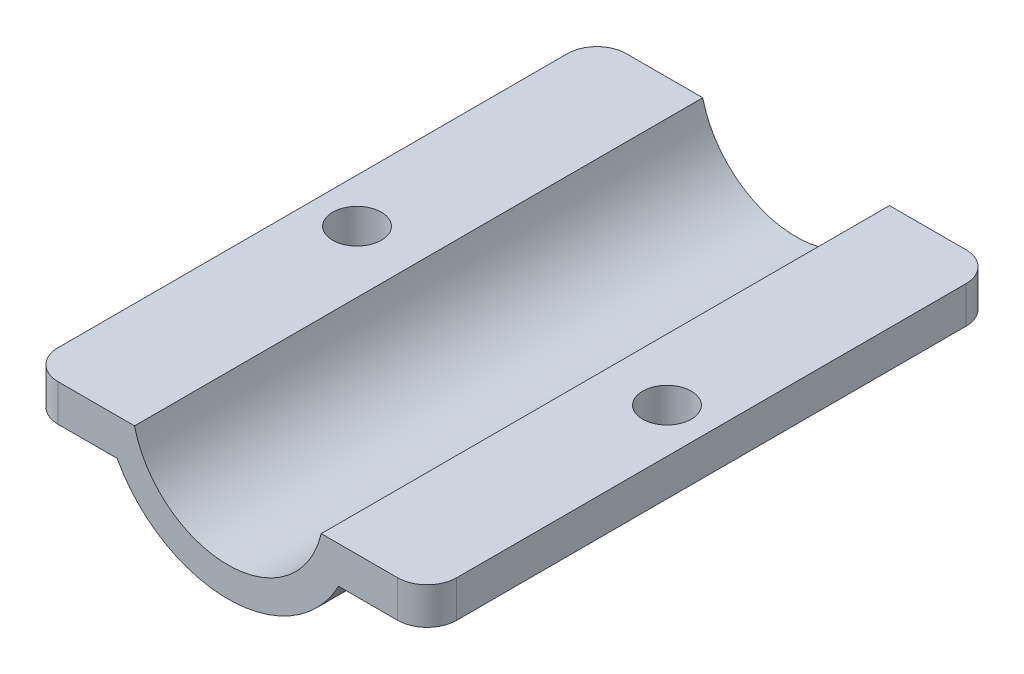
ISO-10303-21;
HEADER;
FILE_DESCRIPTION(('STEP AP214'),'2;1');
FILE_NAME('part.step','',(''),(''),'','','');
FILE_SCHEMA(('AUTOMOTIVE_DESIGN { 1 0 10303 214 1 1 1 1 }'));
ENDSEC;
DATA;
#1=APPLICATION_CONTEXT('core data for automotive mechanical design processes');
#2=APPLICATION_PROTOCOL_DEFINITION('international standard','automotive_design',2000,#1);
#3=PRODUCT_CONTEXT('',#1,'mechanical');
#4=PRODUCT('Part','Part','',(#3));
#5=PRODUCT_RELATED_PRODUCT_CATEGORY('part','',(#4));
#6=PRODUCT_DEFINITION_FORMATION('','',#4);
#7=PRODUCT_DEFINITION_CONTEXT('part definition',#1,'design');
#8=PRODUCT_DEFINITION('design','',#6,#7);
#9=PRODUCT_DEFINITION_SHAPE('','',#8);
#10=(LENGTH_UNIT() NAMED_UNIT(*) SI_UNIT(.MILLI.,.METRE.));
#11=(NAMED_UNIT(*) PLANE_ANGLE_UNIT() SI_UNIT($,.RADIAN.));
#12=(NAMED_UNIT(*) SI_UNIT($,.STERADIAN.) SOLID_ANGLE_UNIT());
#13=UNCERTAINTY_MEASURE_WITH_UNIT(LENGTH_MEASURE(1.E-05),#10,'distance_accuracy_value','');
#14=(GEOMETRIC_REPRESENTATION_CONTEXT(3) GLOBAL_UNCERTAINTY_ASSIGNED_CONTEXT((#13)) GLOBAL_UNIT_ASSIGNED_CONTEXT((#10,
#11,#12)) REPRESENTATION_CONTEXT('',''));
#15=CARTESIAN_POINT('',(0.,0.,0.));
#16=DIRECTION('',(0.,0.,1.));
#17=DIRECTION('',(1.,0.,0.));
#18=AXIS2_PLACEMENT_3D('',#15,#16,#17);
#19=CARTESIAN_POINT('',(0.,0.,38.5));
#20=DIRECTION('',(0.,0.,-1.));
#21=DIRECTION('',(-1.,0.,0.));
#22=AXIS2_PLACEMENT_3D('',#19,#20,#21);
#23=CYLINDRICAL_SURFACE('',#22,6.5);
#24=CARTESIAN_POINT('',(0.,0.,0.));
#25=DIRECTION('',(0.,0.,-1.));
#26=DIRECTION('',(1.,0.,0.));
#27=AXIS2_PLACEMENT_3D('',#24,#25,#26);
#28=CIRCLE('',#27,6.5);
#29=CARTESIAN_POINT('',(6.32455532033676,-1.5,0.));
#30=VERTEX_POINT('',#29);
#31=CARTESIAN_POINT('',(-6.32455532033676,-1.5,0.));
#32=VERTEX_POINT('',#31);
#33=EDGE_CURVE('E148',#30,#32,#28,.T.);
#34=ORIENTED_EDGE('',*,*,#33,.T.);
#35=DIRECTION('',(0.,0.,-1.));
#36=VECTOR('',#35,1.);
#37=CARTESIAN_POINT('',(-6.32455532033676,-1.5,38.5));
#38=LINE('',#37,#36);
#39=CARTESIAN_POINT('',(-6.32455532033676,-1.5,38.5));
#40=VERTEX_POINT('',#39);
#41=EDGE_CURVE('E126',#40,#32,#38,.T.);
#42=ORIENTED_EDGE('',*,*,#41,.F.);
#43=CARTESIAN_POINT('',(0.,0.,38.5));
#44=DIRECTION('',(0.,0.,-1.));
#45=DIRECTION('',(1.,0.,0.));
#46=AXIS2_PLACEMENT_3D('',#43,#44,#45);
#47=CIRCLE('',#46,6.5);
#48=CARTESIAN_POINT('',(6.32455532033676,-1.5,38.5));
#49=VERTEX_POINT('',#48);
#50=EDGE_CURVE('E134',#49,#40,#47,.T.);
#51=ORIENTED_EDGE('',*,*,#50,.F.);
#52=DIRECTION('',(0.,0.,-1.));
#53=VECTOR('',#52,1.);
#54=CARTESIAN_POINT('',(6.32455532033676,-1.5,38.5));
#55=LINE('',#54,#53);
#56=EDGE_CURVE('E204',#49,#30,#55,.T.);
#57=ORIENTED_EDGE('',*,*,#56,.T.);
#58=EDGE_LOOP('',(#34,#42,#51,#57));
#59=FACE_BOUND('',#58,.T.);
#60=ADVANCED_FACE('F34',(#59),#23,.F.);
#61=CARTESIAN_POINT('',(-6.32455532033676,-1.5,38.5));
#62=DIRECTION('',(0.,-1.,0.));
#63=DIRECTION('',(1.,0.,0.));
#64=AXIS2_PLACEMENT_3D('',#61,#62,#63);
#65=PLANE('',#64);
#66=CARTESIAN_POINT('',(-10.5,-1.5,19.25));
#67=DIRECTION('',(0.,-1.,0.));
#68=DIRECTION('',(0.,0.,-1.));
#69=AXIS2_PLACEMENT_3D('',#66,#67,#68);
#70=CIRCLE('',#69,1.65);
#71=CARTESIAN_POINT('',(-10.5,-1.5,17.6));
#72=VERTEX_POINT('',#71);
#73=EDGE_CURVE('E207',#72,#72,#70,.T.);
#74=ORIENTED_EDGE('',*,*,#73,.T.);
#75=EDGE_LOOP('',(#74));
#76=FACE_BOUND('',#75,.T.);
#77=DIRECTION('',(0.,0.,-1.));
#78=VECTOR('',#77,1.);
#79=CARTESIAN_POINT('',(-13.5,-1.5,38.5));
#80=LINE('',#79,#78);
#81=CARTESIAN_POINT('',(-13.5,-1.5,36.5));
#82=VERTEX_POINT('',#81);
#83=CARTESIAN_POINT('',(-13.5,-1.5,2.));
#84=VERTEX_POINT('',#83);
#85=EDGE_CURVE('E150',#82,#84,#80,.T.);
#86=ORIENTED_EDGE('',*,*,#85,.F.);
#87=CARTESIAN_POINT('',(-11.5,-1.5,36.5));
#88=DIRECTION('',(0.,-1.,0.));
#89=DIRECTION('',(1.,0.,0.));
#90=AXIS2_PLACEMENT_3D('',#87,#88,#89);
#91=CIRCLE('',#90,2.);
#92=CARTESIAN_POINT('',(-11.5,-1.5,38.5));
#93=VERTEX_POINT('',#92);
#94=EDGE_CURVE('E129',#82,#93,#91,.F.);
#95=ORIENTED_EDGE('',*,*,#94,.T.);
#96=DIRECTION('',(-1.,0.,0.));
#97=VECTOR('',#96,1.);
#98=CARTESIAN_POINT('',(-6.32455532033676,-1.5,38.5));
#99=LINE('',#98,#97);
#100=EDGE_CURVE('E122',#40,#93,#99,.T.);
#101=ORIENTED_EDGE('',*,*,#100,.F.);
#102=ORIENTED_EDGE('',*,*,#41,.T.);
#103=DIRECTION('',(-1.,0.,0.));
#104=VECTOR('',#103,1.);
#105=CARTESIAN_POINT('',(-6.32455532033676,-1.5,0.));
#106=LINE('',#105,#104);
#107=CARTESIAN_POINT('',(-11.5,-1.5,0.));
#108=VERTEX_POINT('',#107);
#109=EDGE_CURVE('E206',#32,#108,#106,.T.);
#110=ORIENTED_EDGE('',*,*,#109,.T.);
#111=CARTESIAN_POINT('',(-11.5,-1.5,2.));
#112=DIRECTION('',(0.,-1.,0.));
#113=DIRECTION('',(1.,0.,0.));
#114=AXIS2_PLACEMENT_3D('',#111,#112,#113);
#115=CIRCLE('',#114,2.);
#116=EDGE_CURVE('E55',#108,#84,#115,.F.);
#117=ORIENTED_EDGE('',*,*,#116,.T.);
#118=EDGE_LOOP('',(#86,#95,#101,#102,#110,#117));
#119=FACE_BOUND('',#118,.T.);
#120=ADVANCED_FACE('F124',(#76,#119),#65,.F.);
#121=CARTESIAN_POINT('',(-13.5,-1.5,38.5));
#122=DIRECTION('',(1.,0.,0.));
#123=DIRECTION('',(0.,1.,0.));
#124=AXIS2_PLACEMENT_3D('',#121,#122,#123);
#125=PLANE('',#124);
#126=DIRECTION('',(0.,0.,-1.));
#127=VECTOR('',#126,1.);
#128=CARTESIAN_POINT('',(-13.5,-4.,38.5));
#129=LINE('',#128,#127);
#130=CARTESIAN_POINT('',(-13.5,-4.,36.5));
#131=VERTEX_POINT('',#130);
#132=CARTESIAN_POINT('',(-13.5,-4.,2.));
#133=VERTEX_POINT('',#132);
#134=EDGE_CURVE('E154',#131,#133,#129,.T.);
#135=ORIENTED_EDGE('',*,*,#134,.F.);
#136=DIRECTION('',(0.,-1.,0.));
#137=VECTOR('',#136,1.);
#138=CARTESIAN_POINT('',(-13.5,-1.5,36.5));
#139=LINE('',#138,#137);
#140=EDGE_CURVE('E179',#131,#82,#139,.F.);
#141=ORIENTED_EDGE('',*,*,#140,.T.);
#142=ORIENTED_EDGE('',*,*,#85,.T.);
#143=DIRECTION('',(0.,-1.,0.));
#144=VECTOR('',#143,1.);
#145=CARTESIAN_POINT('',(-13.5,-1.5,2.));
#146=LINE('',#145,#144);
#147=EDGE_CURVE('E176',#84,#133,#146,.T.);
#148=ORIENTED_EDGE('',*,*,#147,.T.);
#149=EDGE_LOOP('',(#135,#141,#142,#148));
#150=FACE_BOUND('',#149,.T.);
#151=ADVANCED_FACE('F185',(#150),#125,.F.);
#152=CARTESIAN_POINT('',(-13.5,-4.,38.5));
#153=DIRECTION('',(0.,1.,0.));
#154=DIRECTION('',(0.,0.,1.));
#155=AXIS2_PLACEMENT_3D('',#152,#153,#154);
#156=PLANE('',#155);
#157=CARTESIAN_POINT('',(-10.5,-4.,19.25));
#158=DIRECTION('',(0.,-1.,0.));
#159=DIRECTION('',(0.,0.,-1.));
#160=AXIS2_PLACEMENT_3D('',#157,#158,#159);
#161=CIRCLE('',#160,1.65);
#162=CARTESIAN_POINT('',(-10.5,-4.,17.6));
#163=VERTEX_POINT('',#162);
#164=EDGE_CURVE('E378',#163,#163,#161,.T.);
#165=ORIENTED_EDGE('',*,*,#164,.F.);
#166=EDGE_LOOP('',(#165));
#167=FACE_BOUND('',#166,.T.);
#168=DIRECTION('',(1.,0.,0.));
#169=VECTOR('',#168,1.);
#170=CARTESIAN_POINT('',(-13.5,-4.,38.5));
#171=LINE('',#170,#169);
#172=CARTESIAN_POINT('',(-11.5,-4.,38.5));
#173=VERTEX_POINT('',#172);
#174=CARTESIAN_POINT('',(-7.5,-4.,38.5));
#175=VERTEX_POINT('',#174);
#176=EDGE_CURVE('E133',#173,#175,#171,.T.);
#177=ORIENTED_EDGE('',*,*,#176,.F.);
#178=CARTESIAN_POINT('',(-11.5,-4.,36.5));
#179=DIRECTION('',(0.,1.,0.));
#180=DIRECTION('',(0.,0.,1.));
#181=AXIS2_PLACEMENT_3D('',#178,#179,#180);
#182=CIRCLE('',#181,2.);
#183=EDGE_CURVE('E174',#173,#131,#182,.F.);
#184=ORIENTED_EDGE('',*,*,#183,.T.);
#185=ORIENTED_EDGE('',*,*,#134,.T.);
#186=CARTESIAN_POINT('',(-11.5,-4.,2.));
#187=DIRECTION('',(0.,1.,0.));
#188=DIRECTION('',(0.,0.,1.));
#189=AXIS2_PLACEMENT_3D('',#186,#187,#188);
#190=CIRCLE('',#189,2.);
#191=CARTESIAN_POINT('',(-11.5,-4.,0.));
#192=VERTEX_POINT('',#191);
#193=EDGE_CURVE('E172',#133,#192,#190,.F.);
#194=ORIENTED_EDGE('',*,*,#193,.T.);
#195=DIRECTION('',(1.,0.,0.));
#196=VECTOR('',#195,1.);
#197=CARTESIAN_POINT('',(-13.5,-4.,0.));
#198=LINE('',#197,#196);
#199=CARTESIAN_POINT('',(-7.5,-4.,0.));
#200=VERTEX_POINT('',#199);
#201=EDGE_CURVE('E209',#192,#200,#198,.T.);
#202=ORIENTED_EDGE('',*,*,#201,.T.);
#203=DIRECTION('',(0.,0.,-1.));
#204=VECTOR('',#203,1.);
#205=CARTESIAN_POINT('',(-7.5,-4.,38.5));
#206=LINE('',#205,#204);
#207=EDGE_CURVE('E195',#175,#200,#206,.T.);
#208=ORIENTED_EDGE('',*,*,#207,.F.);
#209=EDGE_LOOP('',(#177,#184,#185,#194,#202,#208));
#210=FACE_BOUND('',#209,.T.);
#211=ADVANCED_FACE('F193',(#167,#210),#156,.F.);
#212=CARTESIAN_POINT('',(0.,0.,38.5));
#213=DIRECTION('',(0.,0.,-1.));
#214=DIRECTION('',(-1.,0.,0.));
#215=AXIS2_PLACEMENT_3D('',#212,#213,#214);
#216=CYLINDRICAL_SURFACE('',#215,8.5);
#217=CARTESIAN_POINT('',(0.,0.,0.));
#218=DIRECTION('',(0.,0.,1.));
#219=DIRECTION('',(1.,0.,0.));
#220=AXIS2_PLACEMENT_3D('',#217,#218,#219);
#221=CIRCLE('',#220,8.5);
#222=CARTESIAN_POINT('',(7.5,-4.,0.));
#223=VERTEX_POINT('',#222);
#224=EDGE_CURVE('E211',#200,#223,#221,.T.);
#225=ORIENTED_EDGE('',*,*,#224,.T.);
#226=DIRECTION('',(0.,0.,-1.));
#227=VECTOR('',#226,1.);
#228=CARTESIAN_POINT('',(7.5,-4.,38.5));
#229=LINE('',#228,#227);
#230=CARTESIAN_POINT('',(7.5,-4.,38.5));
#231=VERTEX_POINT('',#230);
#232=EDGE_CURVE('E224',#231,#223,#229,.T.);
#233=ORIENTED_EDGE('',*,*,#232,.F.);
#234=CARTESIAN_POINT('',(0.,0.,38.5));
#235=DIRECTION('',(0.,0.,1.));
#236=DIRECTION('',(1.,0.,0.));
#237=AXIS2_PLACEMENT_3D('',#234,#235,#236);
#238=CIRCLE('',#237,8.5);
#239=EDGE_CURVE('E197',#175,#231,#238,.T.);
#240=ORIENTED_EDGE('',*,*,#239,.F.);
#241=ORIENTED_EDGE('',*,*,#207,.T.);
#242=EDGE_LOOP('',(#225,#233,#240,#241));
#243=FACE_BOUND('',#242,.T.);
#244=ADVANCED_FACE('F333',(#243),#216,.T.);
#245=CARTESIAN_POINT('',(13.5,-4.,38.5));
#246=DIRECTION('',(0.,1.,0.));
#247=DIRECTION('',(0.,0.,1.));
#248=AXIS2_PLACEMENT_3D('',#245,#246,#247);
#249=PLANE('',#248);
#250=CARTESIAN_POINT('',(10.5,-4.,19.25));
#251=DIRECTION('',(0.,-1.,0.));
#252=DIRECTION('',(0.,0.,-1.));
#253=AXIS2_PLACEMENT_3D('',#250,#251,#252);
#254=CIRCLE('',#253,1.65);
#255=CARTESIAN_POINT('',(10.5,-4.,17.6));
#256=VERTEX_POINT('',#255);
#257=EDGE_CURVE('E385',#256,#256,#254,.T.);
#258=ORIENTED_EDGE('',*,*,#257,.F.);
#259=EDGE_LOOP('',(#258));
#260=FACE_BOUND('',#259,.T.);
#261=DIRECTION('',(0.,0.,-1.));
#262=VECTOR('',#261,1.);
#263=CARTESIAN_POINT('',(13.5,-4.,38.5));
#264=LINE('',#263,#262);
#265=CARTESIAN_POINT('',(13.5,-4.,36.5));
#266=VERTEX_POINT('',#265);
#267=CARTESIAN_POINT('',(13.5,-4.,2.));
#268=VERTEX_POINT('',#267);
#269=EDGE_CURVE('E221',#266,#268,#264,.T.);
#270=ORIENTED_EDGE('',*,*,#269,.F.);
#271=CARTESIAN_POINT('',(11.5,-4.,36.5));
#272=DIRECTION('',(0.,1.,0.));
#273=DIRECTION('',(0.,0.,1.));
#274=AXIS2_PLACEMENT_3D('',#271,#272,#273);
#275=CIRCLE('',#274,2.);
#276=CARTESIAN_POINT('',(11.5,-4.,38.5));
#277=VERTEX_POINT('',#276);
#278=EDGE_CURVE('E170',#266,#277,#275,.F.);
#279=ORIENTED_EDGE('',*,*,#278,.T.);
#280=DIRECTION('',(1.,0.,0.));
#281=VECTOR('',#280,1.);
#282=CARTESIAN_POINT('',(13.5,-4.,38.5));
#283=LINE('',#282,#281);
#284=EDGE_CURVE('E199',#231,#277,#283,.T.);
#285=ORIENTED_EDGE('',*,*,#284,.F.);
#286=ORIENTED_EDGE('',*,*,#232,.T.);
#287=DIRECTION('',(1.,0.,0.));
#288=VECTOR('',#287,1.);
#289=CARTESIAN_POINT('',(13.5,-4.,0.));
#290=LINE('',#289,#288);
#291=CARTESIAN_POINT('',(11.5,-4.,0.));
#292=VERTEX_POINT('',#291);
#293=EDGE_CURVE('E213',#223,#292,#290,.T.);
#294=ORIENTED_EDGE('',*,*,#293,.T.);
#295=CARTESIAN_POINT('',(11.5,-4.,2.));
#296=DIRECTION('',(0.,1.,0.));
#297=DIRECTION('',(0.,0.,1.));
#298=AXIS2_PLACEMENT_3D('',#295,#296,#297);
#299=CIRCLE('',#298,2.);
#300=EDGE_CURVE('E168',#292,#268,#299,.F.);
#301=ORIENTED_EDGE('',*,*,#300,.T.);
#302=EDGE_LOOP('',(#270,#279,#285,#286,#294,#301));
#303=FACE_BOUND('',#302,.T.);
#304=ADVANCED_FACE('F324',(#260,#303),#249,.F.);
#305=CARTESIAN_POINT('',(13.5,-1.5,38.5));
#306=DIRECTION('',(-1.,0.,0.));
#307=DIRECTION('',(0.,-1.,0.));
#308=AXIS2_PLACEMENT_3D('',#305,#306,#307);
#309=PLANE('',#308);
#310=DIRECTION('',(0.,0.,-1.));
#311=VECTOR('',#310,1.);
#312=CARTESIAN_POINT('',(13.5,-1.5,38.5));
#313=LINE('',#312,#311);
#314=CARTESIAN_POINT('',(13.5,-1.5,36.5));
#315=VERTEX_POINT('',#314);
#316=CARTESIAN_POINT('',(13.5,-1.5,2.));
#317=VERTEX_POINT('',#316);
#318=EDGE_CURVE('E218',#315,#317,#313,.T.);
#319=ORIENTED_EDGE('',*,*,#318,.F.);
#320=DIRECTION('',(0.,1.,0.));
#321=VECTOR('',#320,1.);
#322=CARTESIAN_POINT('',(13.5,-4.,36.5));
#323=LINE('',#322,#321);
#324=EDGE_CURVE('E166',#315,#266,#323,.F.);
#325=ORIENTED_EDGE('',*,*,#324,.T.);
#326=ORIENTED_EDGE('',*,*,#269,.T.);
#327=DIRECTION('',(0.,1.,0.));
#328=VECTOR('',#327,1.);
#329=CARTESIAN_POINT('',(13.5,-1.5,2.));
#330=LINE('',#329,#328);
#331=EDGE_CURVE('E163',#268,#317,#330,.T.);
#332=ORIENTED_EDGE('',*,*,#331,.T.);
#333=EDGE_LOOP('',(#319,#325,#326,#332));
#334=FACE_BOUND('',#333,.T.);
#335=ADVANCED_FACE('F315',(#334),#309,.F.);
#336=CARTESIAN_POINT('',(6.32455532033676,-1.5,38.5));
#337=DIRECTION('',(0.,-1.,0.));
#338=DIRECTION('',(1.,0.,0.));
#339=AXIS2_PLACEMENT_3D('',#336,#337,#338);
#340=PLANE('',#339);
#341=CARTESIAN_POINT('',(10.5,-1.5,19.25));
#342=DIRECTION('',(0.,-1.,0.));
#343=DIRECTION('',(0.,0.,-1.));
#344=AXIS2_PLACEMENT_3D('',#341,#342,#343);
#345=CIRCLE('',#344,1.65);
#346=CARTESIAN_POINT('',(10.5,-1.5,17.6));
#347=VERTEX_POINT('',#346);
#348=EDGE_CURVE('E380',#347,#347,#345,.T.);
#349=ORIENTED_EDGE('',*,*,#348,.T.);
#350=EDGE_LOOP('',(#349));
#351=FACE_BOUND('',#350,.T.);
#352=DIRECTION('',(-1.,0.,0.));
#353=VECTOR('',#352,1.);
#354=CARTESIAN_POINT('',(6.32455532033676,-1.5,38.5));
#355=LINE('',#354,#353);
#356=CARTESIAN_POINT('',(11.5,-1.5,38.5));
#357=VERTEX_POINT('',#356);
#358=EDGE_CURVE('E141',#357,#49,#355,.T.);
#359=ORIENTED_EDGE('',*,*,#358,.F.);
#360=CARTESIAN_POINT('',(11.5,-1.5,36.5));
#361=DIRECTION('',(0.,-1.,0.));
#362=DIRECTION('',(1.,0.,0.));
#363=AXIS2_PLACEMENT_3D('',#360,#361,#362);
#364=CIRCLE('',#363,2.);
#365=EDGE_CURVE('E161',#357,#315,#364,.F.);
#366=ORIENTED_EDGE('',*,*,#365,.T.);
#367=ORIENTED_EDGE('',*,*,#318,.T.);
#368=CARTESIAN_POINT('',(11.5,-1.5,2.));
#369=DIRECTION('',(0.,-1.,0.));
#370=DIRECTION('',(1.,0.,0.));
#371=AXIS2_PLACEMENT_3D('',#368,#369,#370);
#372=CIRCLE('',#371,2.);
#373=CARTESIAN_POINT('',(11.5,-1.5,0.));
#374=VERTEX_POINT('',#373);
#375=EDGE_CURVE('E159',#317,#374,#372,.F.);
#376=ORIENTED_EDGE('',*,*,#375,.T.);
#377=DIRECTION('',(-1.,0.,0.));
#378=VECTOR('',#377,1.);
#379=CARTESIAN_POINT('',(6.32455532033676,-1.5,0.));
#380=LINE('',#379,#378);
#381=EDGE_CURVE('E145',#374,#30,#380,.T.);
#382=ORIENTED_EDGE('',*,*,#381,.T.);
#383=ORIENTED_EDGE('',*,*,#56,.F.);
#384=EDGE_LOOP('',(#359,#366,#367,#376,#382,#383));
#385=FACE_BOUND('',#384,.T.);
#386=ADVANCED_FACE('F307',(#351,#385),#340,.F.);
#387=CARTESIAN_POINT('',(0.,0.,38.5));
#388=DIRECTION('',(0.,0.,1.));
#389=DIRECTION('',(1.,0.,0.));
#390=AXIS2_PLACEMENT_3D('',#387,#388,#389);
#391=PLANE('',#390);
#392=ORIENTED_EDGE('',*,*,#284,.T.);
#393=DIRECTION('',(0.,1.,0.));
#394=VECTOR('',#393,1.);
#395=CARTESIAN_POINT('',(11.5,-1.5,38.5));
#396=LINE('',#395,#394);
#397=EDGE_CURVE('E152',#277,#357,#396,.T.);
#398=ORIENTED_EDGE('',*,*,#397,.T.);
#399=ORIENTED_EDGE('',*,*,#358,.T.);
#400=ORIENTED_EDGE('',*,*,#50,.T.);
#401=ORIENTED_EDGE('',*,*,#100,.T.);
#402=DIRECTION('',(0.,-1.,0.));
#403=VECTOR('',#402,1.);
#404=CARTESIAN_POINT('',(-11.5,-4.,38.5));
#405=LINE('',#404,#403);
#406=EDGE_CURVE('E149',#93,#173,#405,.T.);
#407=ORIENTED_EDGE('',*,*,#406,.T.);
#408=ORIENTED_EDGE('',*,*,#176,.T.);
#409=ORIENTED_EDGE('',*,*,#239,.T.);
#410=EDGE_LOOP('',(#392,#398,#399,#400,#401,#407,#408,#409));
#411=FACE_BOUND('',#410,.T.);
#412=ADVANCED_FACE('F138',(#411),#391,.T.);
#413=CARTESIAN_POINT('',(0.,0.,0.));
#414=DIRECTION('',(0.,0.,1.));
#415=DIRECTION('',(1.,0.,0.));
#416=AXIS2_PLACEMENT_3D('',#413,#414,#415);
#417=PLANE('',#416);
#418=ORIENTED_EDGE('',*,*,#381,.F.);
#419=DIRECTION('',(0.,1.,0.));
#420=VECTOR('',#419,1.);
#421=CARTESIAN_POINT('',(11.5,0.,0.));
#422=LINE('',#421,#420);
#423=EDGE_CURVE('E11',#374,#292,#422,.F.);
#424=ORIENTED_EDGE('',*,*,#423,.T.);
#425=ORIENTED_EDGE('',*,*,#293,.F.);
#426=ORIENTED_EDGE('',*,*,#224,.F.);
#427=ORIENTED_EDGE('',*,*,#201,.F.);
#428=DIRECTION('',(0.,-1.,0.));
#429=VECTOR('',#428,1.);
#430=CARTESIAN_POINT('',(-11.5,0.,0.));
#431=LINE('',#430,#429);
#432=EDGE_CURVE('E42',#192,#108,#431,.F.);
#433=ORIENTED_EDGE('',*,*,#432,.T.);
#434=ORIENTED_EDGE('',*,*,#109,.F.);
#435=ORIENTED_EDGE('',*,*,#33,.F.);
#436=EDGE_LOOP('',(#418,#424,#425,#426,#427,#433,#434,#435));
#437=FACE_BOUND('',#436,.T.);
#438=ADVANCED_FACE('F230',(#437),#417,.F.);
#439=CARTESIAN_POINT('',(10.5,-1.5,19.25));
#440=DIRECTION('',(0.,-1.,0.));
#441=DIRECTION('',(0.,0.,-1.));
#442=AXIS2_PLACEMENT_3D('',#439,#440,#441);
#443=CYLINDRICAL_SURFACE('',#442,1.65);
#444=CARTESIAN_POINT('',(10.5,-1.5,17.6));
#445=CARTESIAN_POINT('',(10.5,-1.52604166666667,17.6));
#446=CARTESIAN_POINT('',(10.5,-1.55208333333333,17.6));
#447=CARTESIAN_POINT('',(10.5,-1.60416666666667,17.6));
#448=CARTESIAN_POINT('',(10.5,-1.63020833333333,17.6));
#449=CARTESIAN_POINT('',(10.5,-1.68229166666667,17.6));
#450=CARTESIAN_POINT('',(10.5,-1.70833333333333,17.6));
#451=CARTESIAN_POINT('',(10.5,-1.76041666666667,17.6));
#452=CARTESIAN_POINT('',(10.5,-1.78645833333333,17.6));
#453=CARTESIAN_POINT('',(10.5,-1.83854166666667,17.6));
#454=CARTESIAN_POINT('',(10.5,-1.86458333333333,17.6));
#455=CARTESIAN_POINT('',(10.5,-1.91666666666667,17.6));
#456=CARTESIAN_POINT('',(10.5,-1.94270833333333,17.6));
#457=CARTESIAN_POINT('',(10.5,-1.99479166666667,17.6));
#458=CARTESIAN_POINT('',(10.5,-2.02083333333333,17.6));
#459=CARTESIAN_POINT('',(10.5,-2.07291666666667,17.6));
#460=CARTESIAN_POINT('',(10.5,-2.09895833333333,17.6));
#461=CARTESIAN_POINT('',(10.5,-2.15104166666667,17.6));
#462=CARTESIAN_POINT('',(10.5,-2.17708333333333,17.6));
#463=CARTESIAN_POINT('',(10.5,-2.22916666666667,17.6));
#464=CARTESIAN_POINT('',(10.5,-2.25520833333333,17.6));
#465=CARTESIAN_POINT('',(10.5,-2.30729166666667,17.6));
#466=CARTESIAN_POINT('',(10.5,-2.33333333333333,17.6));
#467=CARTESIAN_POINT('',(10.5,-2.38541666666667,17.6));
#468=CARTESIAN_POINT('',(10.5,-2.41145833333333,17.6));
#469=CARTESIAN_POINT('',(10.5,-2.46354166666667,17.6));
#470=CARTESIAN_POINT('',(10.5,-2.48958333333333,17.6));
#471=CARTESIAN_POINT('',(10.5,-2.54166666666667,17.6));
#472=CARTESIAN_POINT('',(10.5,-2.56770833333333,17.6));
#473=CARTESIAN_POINT('',(10.5,-2.61979166666667,17.6));
#474=CARTESIAN_POINT('',(10.5,-2.64583333333333,17.6));
#475=CARTESIAN_POINT('',(10.5,-2.69791666666667,17.6));
#476=CARTESIAN_POINT('',(10.5,-2.72395833333333,17.6));
#477=CARTESIAN_POINT('',(10.5,-2.77604166666667,17.6));
#478=CARTESIAN_POINT('',(10.5,-2.80208333333333,17.6));
#479=CARTESIAN_POINT('',(10.5,-2.85416666666667,17.6));
#480=CARTESIAN_POINT('',(10.5,-2.88020833333333,17.6));
#481=CARTESIAN_POINT('',(10.5,-2.93229166666667,17.6));
#482=CARTESIAN_POINT('',(10.5,-2.95833333333333,17.6));
#483=CARTESIAN_POINT('',(10.5,-3.01041666666667,17.6));
#484=CARTESIAN_POINT('',(10.5,-3.03645833333333,17.6));
#485=CARTESIAN_POINT('',(10.5,-3.08854166666667,17.6));
#486=CARTESIAN_POINT('',(10.5,-3.11458333333333,17.6));
#487=CARTESIAN_POINT('',(10.5,-3.16666666666667,17.6));
#488=CARTESIAN_POINT('',(10.5,-3.19270833333333,17.6));
#489=CARTESIAN_POINT('',(10.5,-3.24479166666667,17.6));
#490=CARTESIAN_POINT('',(10.5,-3.27083333333333,17.6));
#491=CARTESIAN_POINT('',(10.5,-3.32291666666667,17.6));
#492=CARTESIAN_POINT('',(10.5,-3.34895833333333,17.6));
#493=CARTESIAN_POINT('',(10.5,-3.40104166666667,17.6));
#494=CARTESIAN_POINT('',(10.5,-3.42708333333333,17.6));
#495=CARTESIAN_POINT('',(10.5,-3.47916666666667,17.6));
#496=CARTESIAN_POINT('',(10.5,-3.50520833333333,17.6));
#497=CARTESIAN_POINT('',(10.5,-3.55729166666667,17.6));
#498=CARTESIAN_POINT('',(10.5,-3.58333333333333,17.6));
#499=CARTESIAN_POINT('',(10.5,-3.63541666666667,17.6));
#500=CARTESIAN_POINT('',(10.5,-3.66145833333333,17.6));
#501=CARTESIAN_POINT('',(10.5,-3.71354166666667,17.6));
#502=CARTESIAN_POINT('',(10.5,-3.73958333333333,17.6));
#503=CARTESIAN_POINT('',(10.5,-3.79166666666667,17.6));
#504=CARTESIAN_POINT('',(10.5,-3.81770833333333,17.6));
#505=CARTESIAN_POINT('',(10.5,-3.86979166666667,17.6));
#506=CARTESIAN_POINT('',(10.5,-3.89583333333333,17.6));
#507=CARTESIAN_POINT('',(10.5,-3.94791666666667,17.6));
#508=CARTESIAN_POINT('',(10.5,-3.97395833333333,17.6));
#509=CARTESIAN_POINT('',(10.5,-4.,17.6));
#510=B_SPLINE_CURVE_WITH_KNOTS('',3,(#444,#445,#446,#447,#448,#449,#450,#451,#452,#453,#454,
#455,#456,#457,#458,#459,#460,#461,#462,#463,#464,#465,#466,#467,#468,#469,#470,#471,#472,#473,
#474,#475,#476,#477,#478,#479,#480,#481,#482,#483,#484,#485,#486,#487,#488,#489,#490,#491,#492,
#493,#494,#495,#496,#497,#498,#499,#500,#501,#502,#503,#504,#505,#506,#507,#508,#509),
.UNSPECIFIED.,.F.,.F.,(4,2,2,2,2,2,2,2,2,2,2,2,2,2,2,2,2,2,2,2,2,2,2,2,2,2,2,2,2,2,2,2,4),(0.,
0.0781249999999998,0.15625,0.234375,0.3125,0.390625,0.46875,0.546875,0.625,0.703125,0.78125,
0.859375,0.9375,1.015625,1.09375,1.171875,1.25,1.328125,1.40625,1.484375,1.5625,1.640625,
1.71875,1.796875,1.875,1.953125,2.03125,2.109375,2.1875,2.265625,2.34375,2.421875,2.5),.UNSPECIFIED.);
#511=EDGE_CURVE('BSEAM282',#347,#256,#510,.T.);
#512=ORIENTED_EDGE('',*,*,#348,.F.);
#513=ORIENTED_EDGE('',*,*,#257,.T.);
#514=ORIENTED_EDGE('',*,*,#511,.T.);
#515=ORIENTED_EDGE('',*,*,#511,.F.);
#516=EDGE_LOOP('',(#512,#514,#513,#515));
#517=FACE_BOUND('',#516,.T.);
#518=ADVANCED_FACE('F282',(#517),#443,.F.);
#519=CARTESIAN_POINT('',(-10.5,-1.5,19.25));
#520=DIRECTION('',(0.,-1.,0.));
#521=DIRECTION('',(0.,0.,-1.));
#522=AXIS2_PLACEMENT_3D('',#519,#520,#521);
#523=CYLINDRICAL_SURFACE('',#522,1.65);
#524=CARTESIAN_POINT('',(-10.5,-1.5,17.6));
#525=CARTESIAN_POINT('',(-10.5,-1.52604166666667,17.6));
#526=CARTESIAN_POINT('',(-10.5,-1.55208333333333,17.6));
#527=CARTESIAN_POINT('',(-10.5,-1.60416666666667,17.6));
#528=CARTESIAN_POINT('',(-10.5,-1.63020833333333,17.6));
#529=CARTESIAN_POINT('',(-10.5,-1.68229166666667,17.6));
#530=CARTESIAN_POINT('',(-10.5,-1.70833333333333,17.6));
#531=CARTESIAN_POINT('',(-10.5,-1.76041666666667,17.6));
#532=CARTESIAN_POINT('',(-10.5,-1.78645833333333,17.6));
#533=CARTESIAN_POINT('',(-10.5,-1.83854166666667,17.6));
#534=CARTESIAN_POINT('',(-10.5,-1.86458333333333,17.6));
#535=CARTESIAN_POINT('',(-10.5,-1.91666666666667,17.6));
#536=CARTESIAN_POINT('',(-10.5,-1.94270833333333,17.6));
#537=CARTESIAN_POINT('',(-10.5,-1.99479166666667,17.6));
#538=CARTESIAN_POINT('',(-10.5,-2.02083333333333,17.6));
#539=CARTESIAN_POINT('',(-10.5,-2.07291666666667,17.6));
#540=CARTESIAN_POINT('',(-10.5,-2.09895833333333,17.6));
#541=CARTESIAN_POINT('',(-10.5,-2.15104166666667,17.6));
#542=CARTESIAN_POINT('',(-10.5,-2.17708333333333,17.6));
#543=CARTESIAN_POINT('',(-10.5,-2.22916666666667,17.6));
#544=CARTESIAN_POINT('',(-10.5,-2.25520833333333,17.6));
#545=CARTESIAN_POINT('',(-10.5,-2.30729166666667,17.6));
#546=CARTESIAN_POINT('',(-10.5,-2.33333333333333,17.6));
#547=CARTESIAN_POINT('',(-10.5,-2.38541666666667,17.6));
#548=CARTESIAN_POINT('',(-10.5,-2.41145833333333,17.6));
#549=CARTESIAN_POINT('',(-10.5,-2.46354166666667,17.6));
#550=CARTESIAN_POINT('',(-10.5,-2.48958333333333,17.6));
#551=CARTESIAN_POINT('',(-10.5,-2.54166666666667,17.6));
#552=CARTESIAN_POINT('',(-10.5,-2.56770833333333,17.6));
#553=CARTESIAN_POINT('',(-10.5,-2.61979166666667,17.6));
#554=CARTESIAN_POINT('',(-10.5,-2.64583333333333,17.6));
#555=CARTESIAN_POINT('',(-10.5,-2.69791666666667,17.6));
#556=CARTESIAN_POINT('',(-10.5,-2.72395833333333,17.6));
#557=CARTESIAN_POINT('',(-10.5,-2.77604166666667,17.6));
#558=CARTESIAN_POINT('',(-10.5,-2.80208333333333,17.6));
#559=CARTESIAN_POINT('',(-10.5,-2.85416666666667,17.6));
#560=CARTESIAN_POINT('',(-10.5,-2.88020833333333,17.6));
#561=CARTESIAN_POINT('',(-10.5,-2.93229166666667,17.6));
#562=CARTESIAN_POINT('',(-10.5,-2.95833333333333,17.6));
#563=CARTESIAN_POINT('',(-10.5,-3.01041666666667,17.6));
#564=CARTESIAN_POINT('',(-10.5,-3.03645833333333,17.6));
#565=CARTESIAN_POINT('',(-10.5,-3.08854166666667,17.6));
#566=CARTESIAN_POINT('',(-10.5,-3.11458333333333,17.6));
#567=CARTESIAN_POINT('',(-10.5,-3.16666666666667,17.6));
#568=CARTESIAN_POINT('',(-10.5,-3.19270833333333,17.6));
#569=CARTESIAN_POINT('',(-10.5,-3.24479166666667,17.6));
#570=CARTESIAN_POINT('',(-10.5,-3.27083333333333,17.6));
#571=CARTESIAN_POINT('',(-10.5,-3.32291666666667,17.6));
#572=CARTESIAN_POINT('',(-10.5,-3.34895833333333,17.6));
#573=CARTESIAN_POINT('',(-10.5,-3.40104166666667,17.6));
#574=CARTESIAN_POINT('',(-10.5,-3.42708333333333,17.6));
#575=CARTESIAN_POINT('',(-10.5,-3.47916666666667,17.6));
#576=CARTESIAN_POINT('',(-10.5,-3.50520833333333,17.6));
#577=CARTESIAN_POINT('',(-10.5,-3.55729166666667,17.6));
#578=CARTESIAN_POINT('',(-10.5,-3.58333333333333,17.6));
#579=CARTESIAN_POINT('',(-10.5,-3.63541666666667,17.6));
#580=CARTESIAN_POINT('',(-10.5,-3.66145833333333,17.6));
#581=CARTESIAN_POINT('',(-10.5,-3.71354166666667,17.6));
#582=CARTESIAN_POINT('',(-10.5,-3.73958333333333,17.6));
#583=CARTESIAN_POINT('',(-10.5,-3.79166666666667,17.6));
#584=CARTESIAN_POINT('',(-10.5,-3.81770833333333,17.6));
#585=CARTESIAN_POINT('',(-10.5,-3.86979166666667,17.6));
#586=CARTESIAN_POINT('',(-10.5,-3.89583333333333,17.6));
#587=CARTESIAN_POINT('',(-10.5,-3.94791666666667,17.6));
#588=CARTESIAN_POINT('',(-10.5,-3.97395833333333,17.6));
#589=CARTESIAN_POINT('',(-10.5,-4.,17.6));
#590=B_SPLINE_CURVE_WITH_KNOTS('',3,(#524,#525,#526,#527,#528,#529,#530,#531,#532,#533,#534,
#535,#536,#537,#538,#539,#540,#541,#542,#543,#544,#545,#546,#547,#548,#549,#550,#551,#552,#553,
#554,#555,#556,#557,#558,#559,#560,#561,#562,#563,#564,#565,#566,#567,#568,#569,#570,#571,#572,
#573,#574,#575,#576,#577,#578,#579,#580,#581,#582,#583,#584,#585,#586,#587,#588,#589),
.UNSPECIFIED.,.F.,.F.,(4,2,2,2,2,2,2,2,2,2,2,2,2,2,2,2,2,2,2,2,2,2,2,2,2,2,2,2,2,2,2,2,4),(0.,
0.0781249999999998,0.15625,0.234375,0.3125,0.390625,0.46875,0.546875,0.625,0.703125,0.78125,
0.859375,0.9375,1.015625,1.09375,1.171875,1.25,1.328125,1.40625,1.484375,1.5625,1.640625,
1.71875,1.796875,1.875,1.953125,2.03125,2.109375,2.1875,2.265625,2.34375,2.421875,2.5),.UNSPECIFIED.);
#591=EDGE_CURVE('BSEAM250',#72,#163,#590,.T.);
#592=ORIENTED_EDGE('',*,*,#73,.F.);
#593=ORIENTED_EDGE('',*,*,#164,.T.);
#594=ORIENTED_EDGE('',*,*,#591,.T.);
#595=ORIENTED_EDGE('',*,*,#591,.F.);
#596=EDGE_LOOP('',(#592,#594,#593,#595));
#597=FACE_BOUND('',#596,.T.);
#598=ADVANCED_FACE('F250',(#597),#523,.F.);
#599=CARTESIAN_POINT('',(11.5,0.,36.5));
#600=DIRECTION('',(0.,-1.,0.));
#601=DIRECTION('',(1.,0.,0.));
#602=AXIS2_PLACEMENT_3D('',#599,#600,#601);
#603=CYLINDRICAL_SURFACE('',#602,2.);
#604=ORIENTED_EDGE('',*,*,#278,.F.);
#605=ORIENTED_EDGE('',*,*,#324,.F.);
#606=ORIENTED_EDGE('',*,*,#365,.F.);
#607=ORIENTED_EDGE('',*,*,#397,.F.);
#608=EDGE_LOOP('',(#604,#605,#606,#607));
#609=FACE_BOUND('',#608,.T.);
#610=ADVANCED_FACE('F247',(#609),#603,.T.);
#611=CARTESIAN_POINT('',(-11.5,0.,36.5));
#612=DIRECTION('',(0.,1.,0.));
#613=DIRECTION('',(-1.,0.,0.));
#614=AXIS2_PLACEMENT_3D('',#611,#612,#613);
#615=CYLINDRICAL_SURFACE('',#614,2.);
#616=ORIENTED_EDGE('',*,*,#94,.F.);
#617=ORIENTED_EDGE('',*,*,#140,.F.);
#618=ORIENTED_EDGE('',*,*,#183,.F.);
#619=ORIENTED_EDGE('',*,*,#406,.F.);
#620=EDGE_LOOP('',(#616,#617,#618,#619));
#621=FACE_BOUND('',#620,.T.);
#622=ADVANCED_FACE('F189',(#621),#615,.T.);
#623=CARTESIAN_POINT('',(11.5,-1.5,2.));
#624=DIRECTION('',(0.,1.,0.));
#625=DIRECTION('',(-1.,0.,0.));
#626=AXIS2_PLACEMENT_3D('',#623,#624,#625);
#627=CYLINDRICAL_SURFACE('',#626,2.);
#628=ORIENTED_EDGE('',*,*,#300,.F.);
#629=ORIENTED_EDGE('',*,*,#423,.F.);
#630=ORIENTED_EDGE('',*,*,#375,.F.);
#631=ORIENTED_EDGE('',*,*,#331,.F.);
#632=EDGE_LOOP('',(#628,#629,#630,#631));
#633=FACE_BOUND('',#632,.T.);
#634=ADVANCED_FACE('F233',(#633),#627,.T.);
#635=CARTESIAN_POINT('',(-11.5,-1.5,2.));
#636=DIRECTION('',(0.,-1.,0.));
#637=DIRECTION('',(1.,0.,0.));
#638=AXIS2_PLACEMENT_3D('',#635,#636,#637);
#639=CYLINDRICAL_SURFACE('',#638,2.);
#640=ORIENTED_EDGE('',*,*,#116,.F.);
#641=ORIENTED_EDGE('',*,*,#432,.F.);
#642=ORIENTED_EDGE('',*,*,#193,.F.);
#643=ORIENTED_EDGE('',*,*,#147,.F.);
#644=EDGE_LOOP('',(#640,#641,#642,#643));
#645=FACE_BOUND('',#644,.T.);
#646=ADVANCED_FACE('F36',(#645),#639,.T.);
#647=CLOSED_SHELL('',(#60,#120,#151,#211,#244,#304,#335,#386,#412,#438,#518,#598,#610,#622,#634,#646));
#648=MANIFOLD_SOLID_BREP('B2',#647);
#649=ADVANCED_BREP_SHAPE_REPRESENTATION('',(#18,#648),#14);
#650=SHAPE_DEFINITION_REPRESENTATION(#9,#649);
ENDSEC;
END-ISO-10303-21;
